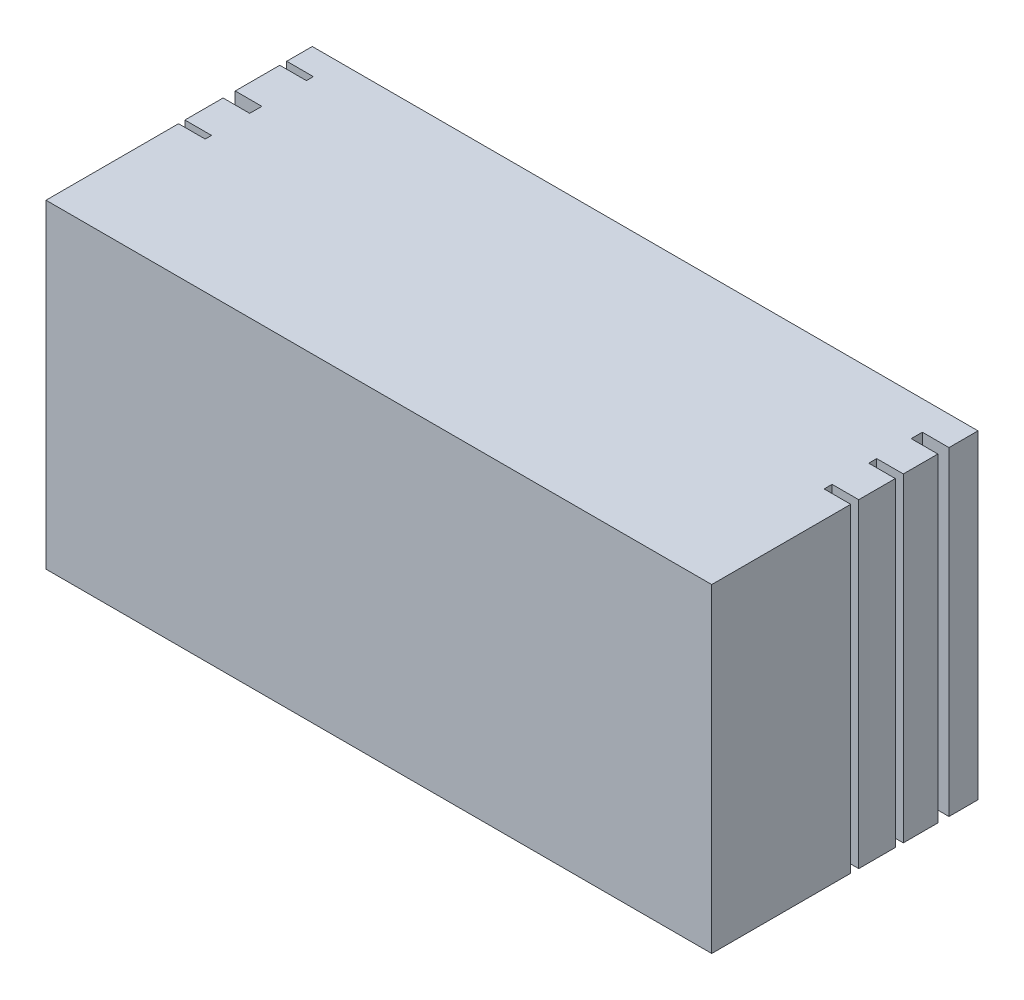
ISO-10303-21;
HEADER;
FILE_DESCRIPTION(('STEP AP214'),'2;1');
FILE_NAME('part.step','',(''),(''),'','','');
FILE_SCHEMA(('AUTOMOTIVE_DESIGN { 1 0 10303 214 1 1 1 1 }'));
ENDSEC;
DATA;
#1=APPLICATION_CONTEXT('core data for automotive mechanical design processes');
#2=APPLICATION_PROTOCOL_DEFINITION('international standard','automotive_design',2000,#1);
#3=PRODUCT_CONTEXT('',#1,'mechanical');
#4=PRODUCT('Part','Part','',(#3));
#5=PRODUCT_RELATED_PRODUCT_CATEGORY('part','',(#4));
#6=PRODUCT_DEFINITION_FORMATION('','',#4);
#7=PRODUCT_DEFINITION_CONTEXT('part definition',#1,'design');
#8=PRODUCT_DEFINITION('design','',#6,#7);
#9=PRODUCT_DEFINITION_SHAPE('','',#8);
#10=(LENGTH_UNIT() NAMED_UNIT(*) SI_UNIT(.MILLI.,.METRE.));
#11=(NAMED_UNIT(*) PLANE_ANGLE_UNIT() SI_UNIT($,.RADIAN.));
#12=(NAMED_UNIT(*) SI_UNIT($,.STERADIAN.) SOLID_ANGLE_UNIT());
#13=UNCERTAINTY_MEASURE_WITH_UNIT(LENGTH_MEASURE(1.E-05),#10,'distance_accuracy_value','');
#14=(GEOMETRIC_REPRESENTATION_CONTEXT(3) GLOBAL_UNCERTAINTY_ASSIGNED_CONTEXT((#13)) GLOBAL_UNIT_ASSIGNED_CONTEXT((#10,
#11,#12)) REPRESENTATION_CONTEXT('',''));
#15=CARTESIAN_POINT('',(0.,0.,0.));
#16=DIRECTION('',(0.,0.,1.));
#17=DIRECTION('',(1.,0.,0.));
#18=AXIS2_PLACEMENT_3D('',#15,#16,#17);
#19=CARTESIAN_POINT('',(-80.,60.,100.));
#20=DIRECTION('',(1.,0.,0.));
#21=DIRECTION('',(0.,1.,0.));
#22=AXIS2_PLACEMENT_3D('',#19,#20,#21);
#23=PLANE('',#22);
#24=DIRECTION('',(0.,0.,-1.));
#25=VECTOR('',#24,1.);
#26=CARTESIAN_POINT('',(-80.,-60.,100.));
#27=LINE('',#26,#25);
#28=CARTESIAN_POINT('',(-80.,-60.,9.60709957004355));
#29=VERTEX_POINT('',#28);
#30=CARTESIAN_POINT('',(-80.,-60.,0.));
#31=VERTEX_POINT('',#30);
#32=EDGE_CURVE('E267',#29,#31,#27,.T.);
#33=ORIENTED_EDGE('',*,*,#32,.F.);
#34=DIRECTION('',(0.,-1.,0.));
#35=VECTOR('',#34,1.);
#36=CARTESIAN_POINT('',(-80.,69.9495288911961,9.60709957004355));
#37=LINE('',#36,#35);
#38=CARTESIAN_POINT('',(-80.,60.,9.60709957004355));
#39=VERTEX_POINT('',#38);
#40=EDGE_CURVE('E433',#39,#29,#37,.T.);
#41=ORIENTED_EDGE('',*,*,#40,.F.);
#42=DIRECTION('',(0.,0.,-1.));
#43=VECTOR('',#42,1.);
#44=CARTESIAN_POINT('',(-80.,60.,100.));
#45=LINE('',#44,#43);
#46=CARTESIAN_POINT('',(-80.,60.,0.));
#47=VERTEX_POINT('',#46);
#48=EDGE_CURVE('E253',#39,#47,#45,.T.);
#49=ORIENTED_EDGE('',*,*,#48,.T.);
#50=DIRECTION('',(0.,-1.,0.));
#51=VECTOR('',#50,1.);
#52=CARTESIAN_POINT('',(-80.,60.,0.));
#53=LINE('',#52,#51);
#54=EDGE_CURVE('E405',#47,#31,#53,.T.);
#55=ORIENTED_EDGE('',*,*,#54,.T.);
#56=EDGE_LOOP('',(#33,#41,#49,#55));
#57=FACE_BOUND('',#56,.T.);
#58=ADVANCED_FACE('F35',(#57),#23,.F.);
#59=CARTESIAN_POINT('',(-80.,60.,28.9399266792238));
#60=VERTEX_POINT('',#59);
#61=CARTESIAN_POINT('',(-80.,60.,12.2137728881353));
#62=VERTEX_POINT('',#61);
#63=EDGE_CURVE('E249',#60,#62,#45,.T.);
#64=ORIENTED_EDGE('',*,*,#63,.T.);
#65=DIRECTION('',(0.,1.,0.));
#66=VECTOR('',#65,1.);
#67=CARTESIAN_POINT('',(-80.,69.9495288911961,12.2137728881353));
#68=LINE('',#67,#66);
#69=CARTESIAN_POINT('',(-80.,-60.,12.2137728881353));
#70=VERTEX_POINT('',#69);
#71=EDGE_CURVE('E315',#70,#62,#68,.T.);
#72=ORIENTED_EDGE('',*,*,#71,.F.);
#73=CARTESIAN_POINT('',(-80.,-60.,28.9399266792238));
#74=VERTEX_POINT('',#73);
#75=EDGE_CURVE('E318',#74,#70,#27,.T.);
#76=ORIENTED_EDGE('',*,*,#75,.F.);
#77=DIRECTION('',(0.,-1.,0.));
#78=VECTOR('',#77,1.);
#79=CARTESIAN_POINT('',(-80.,69.9495288911961,28.9399266792238));
#80=LINE('',#79,#78);
#81=EDGE_CURVE('E317',#60,#74,#80,.T.);
#82=ORIENTED_EDGE('',*,*,#81,.F.);
#83=EDGE_LOOP('',(#64,#72,#76,#82));
#84=FACE_BOUND('',#83,.T.);
#85=ADVANCED_FACE('F313',(#84),#23,.F.);
#86=CARTESIAN_POINT('',(-80.,60.,47.8383082353889));
#87=VERTEX_POINT('',#86);
#88=CARTESIAN_POINT('',(-80.,60.,33.5016049858844));
#89=VERTEX_POINT('',#88);
#90=EDGE_CURVE('E238',#87,#89,#45,.T.);
#91=ORIENTED_EDGE('',*,*,#90,.T.);
#92=DIRECTION('',(0.,1.,0.));
#93=VECTOR('',#92,1.);
#94=CARTESIAN_POINT('',(-80.,69.9495288911961,33.5016049858844));
#95=LINE('',#94,#93);
#96=CARTESIAN_POINT('',(-80.,-60.,33.5016049858844));
#97=VERTEX_POINT('',#96);
#98=EDGE_CURVE('E321',#97,#89,#95,.T.);
#99=ORIENTED_EDGE('',*,*,#98,.F.);
#100=CARTESIAN_POINT('',(-80.,-60.,47.8383082353889));
#101=VERTEX_POINT('',#100);
#102=EDGE_CURVE('E240',#101,#97,#27,.T.);
#103=ORIENTED_EDGE('',*,*,#102,.F.);
#104=DIRECTION('',(0.,-1.,0.));
#105=VECTOR('',#104,1.);
#106=CARTESIAN_POINT('',(-80.,69.9495288911961,47.8383082353889));
#107=LINE('',#106,#105);
#108=EDGE_CURVE('E223',#87,#101,#107,.T.);
#109=ORIENTED_EDGE('',*,*,#108,.F.);
#110=EDGE_LOOP('',(#91,#99,#103,#109));
#111=FACE_BOUND('',#110,.T.);
#112=ADVANCED_FACE('F236',(#111),#23,.F.);
#113=CARTESIAN_POINT('',(170.,60.,100.));
#114=DIRECTION('',(-1.,0.,0.));
#115=DIRECTION('',(0.,-1.,0.));
#116=AXIS2_PLACEMENT_3D('',#113,#114,#115);
#117=PLANE('',#116);
#118=DIRECTION('',(0.,0.,-1.));
#119=VECTOR('',#118,1.);
#120=CARTESIAN_POINT('',(170.,-60.,100.));
#121=LINE('',#120,#119);
#122=CARTESIAN_POINT('',(170.,-60.,100.));
#123=VERTEX_POINT('',#122);
#124=CARTESIAN_POINT('',(170.,-60.,47.796564822313));
#125=VERTEX_POINT('',#124);
#126=EDGE_CURVE('E264',#123,#125,#121,.T.);
#127=ORIENTED_EDGE('',*,*,#126,.T.);
#128=DIRECTION('',(0.,-1.,0.));
#129=VECTOR('',#128,1.);
#130=CARTESIAN_POINT('',(170.,73.27997279776,47.796564822313));
#131=LINE('',#130,#129);
#132=CARTESIAN_POINT('',(170.,60.,47.796564822313));
#133=VERTEX_POINT('',#132);
#134=EDGE_CURVE('E362',#133,#125,#131,.T.);
#135=ORIENTED_EDGE('',*,*,#134,.F.);
#136=DIRECTION('',(0.,0.,-1.));
#137=VECTOR('',#136,1.);
#138=CARTESIAN_POINT('',(170.,60.,100.));
#139=LINE('',#138,#137);
#140=CARTESIAN_POINT('',(170.,60.,100.));
#141=VERTEX_POINT('',#140);
#142=EDGE_CURVE('E259',#141,#133,#139,.T.);
#143=ORIENTED_EDGE('',*,*,#142,.F.);
#144=DIRECTION('',(0.,1.,0.));
#145=VECTOR('',#144,1.);
#146=CARTESIAN_POINT('',(170.,60.,100.));
#147=LINE('',#146,#145);
#148=EDGE_CURVE('E411',#123,#141,#147,.T.);
#149=ORIENTED_EDGE('',*,*,#148,.F.);
#150=EDGE_LOOP('',(#127,#135,#143,#149));
#151=FACE_BOUND('',#150,.T.);
#152=ADVANCED_FACE('F477',(#151),#117,.F.);
#153=CARTESIAN_POINT('',(170.,60.,44.796564822313));
#154=VERTEX_POINT('',#153);
#155=CARTESIAN_POINT('',(170.,60.,31.0468567542537));
#156=VERTEX_POINT('',#155);
#157=EDGE_CURVE('E263',#154,#156,#139,.T.);
#158=ORIENTED_EDGE('',*,*,#157,.F.);
#159=DIRECTION('',(0.,1.,0.));
#160=VECTOR('',#159,1.);
#161=CARTESIAN_POINT('',(170.,73.27997279776,44.796564822313));
#162=LINE('',#161,#160);
#163=CARTESIAN_POINT('',(170.,-60.,44.796564822313));
#164=VERTEX_POINT('',#163);
#165=EDGE_CURVE('E359',#164,#154,#162,.T.);
#166=ORIENTED_EDGE('',*,*,#165,.F.);
#167=CARTESIAN_POINT('',(170.,-60.,31.0468567542537));
#168=VERTEX_POINT('',#167);
#169=EDGE_CURVE('E268',#164,#168,#121,.T.);
#170=ORIENTED_EDGE('',*,*,#169,.T.);
#171=DIRECTION('',(0.,-1.,0.));
#172=VECTOR('',#171,1.);
#173=CARTESIAN_POINT('',(170.,73.27997279776,31.0468567542537));
#174=LINE('',#173,#172);
#175=EDGE_CURVE('E371',#156,#168,#174,.T.);
#176=ORIENTED_EDGE('',*,*,#175,.F.);
#177=EDGE_LOOP('',(#158,#166,#170,#176));
#178=FACE_BOUND('',#177,.T.);
#179=ADVANCED_FACE('F473',(#178),#117,.F.);
#180=CARTESIAN_POINT('',(170.,60.,28.0468567542537));
#181=VERTEX_POINT('',#180);
#182=CARTESIAN_POINT('',(170.,60.,15.0822912518846));
#183=VERTEX_POINT('',#182);
#184=EDGE_CURVE('E494',#181,#183,#139,.T.);
#185=ORIENTED_EDGE('',*,*,#184,.F.);
#186=DIRECTION('',(0.,1.,0.));
#187=VECTOR('',#186,1.);
#188=CARTESIAN_POINT('',(170.,73.27997279776,28.0468567542537));
#189=LINE('',#188,#187);
#190=CARTESIAN_POINT('',(170.,-60.,28.0468567542537));
#191=VERTEX_POINT('',#190);
#192=EDGE_CURVE('E369',#191,#181,#189,.T.);
#193=ORIENTED_EDGE('',*,*,#192,.F.);
#194=CARTESIAN_POINT('',(170.,-60.,15.0822912518846));
#195=VERTEX_POINT('',#194);
#196=EDGE_CURVE('E520',#191,#195,#121,.T.);
#197=ORIENTED_EDGE('',*,*,#196,.T.);
#198=DIRECTION('',(0.,-1.,0.));
#199=VECTOR('',#198,1.);
#200=CARTESIAN_POINT('',(170.,73.27997279776,15.0822912518846));
#201=LINE('',#200,#199);
#202=EDGE_CURVE('E354',#183,#195,#201,.T.);
#203=ORIENTED_EDGE('',*,*,#202,.F.);
#204=EDGE_LOOP('',(#185,#193,#197,#203));
#205=FACE_BOUND('',#204,.T.);
#206=ADVANCED_FACE('F466',(#205),#117,.F.);
#207=CARTESIAN_POINT('',(-80.,60.,100.));
#208=VERTEX_POINT('',#207);
#209=CARTESIAN_POINT('',(-80.,60.,50.227758776973));
#210=VERTEX_POINT('',#209);
#211=EDGE_CURVE('E248',#208,#210,#45,.T.);
#212=ORIENTED_EDGE('',*,*,#211,.T.);
#213=DIRECTION('',(0.,1.,0.));
#214=VECTOR('',#213,1.);
#215=CARTESIAN_POINT('',(-80.,69.9495288911961,50.227758776973));
#216=LINE('',#215,#214);
#217=CARTESIAN_POINT('',(-80.,-60.,50.227758776973));
#218=VERTEX_POINT('',#217);
#219=EDGE_CURVE('E241',#218,#210,#216,.T.);
#220=ORIENTED_EDGE('',*,*,#219,.F.);
#221=CARTESIAN_POINT('',(-80.,-60.,100.));
#222=VERTEX_POINT('',#221);
#223=EDGE_CURVE('E269',#222,#218,#27,.T.);
#224=ORIENTED_EDGE('',*,*,#223,.F.);
#225=DIRECTION('',(0.,-1.,0.));
#226=VECTOR('',#225,1.);
#227=CARTESIAN_POINT('',(-80.,60.,100.));
#228=LINE('',#227,#226);
#229=EDGE_CURVE('E406',#208,#222,#228,.T.);
#230=ORIENTED_EDGE('',*,*,#229,.F.);
#231=EDGE_LOOP('',(#212,#220,#224,#230));
#232=FACE_BOUND('',#231,.T.);
#233=ADVANCED_FACE('F37',(#232),#23,.F.);
#234=CARTESIAN_POINT('',(-80.,-60.,100.));
#235=DIRECTION('',(0.,1.,0.));
#236=DIRECTION('',(0.,0.,1.));
#237=AXIS2_PLACEMENT_3D('',#234,#235,#236);
#238=PLANE('',#237);
#239=DIRECTION('',(0.,0.,1.));
#240=VECTOR('',#239,1.);
#241=CARTESIAN_POINT('',(-70.,-60.,100.));
#242=LINE('',#241,#240);
#243=CARTESIAN_POINT('',(-70.,-60.,9.60709957004355));
#244=VERTEX_POINT('',#243);
#245=CARTESIAN_POINT('',(-70.,-60.,12.2137728881353));
#246=VERTEX_POINT('',#245);
#247=EDGE_CURVE('E346',#244,#246,#242,.T.);
#248=ORIENTED_EDGE('',*,*,#247,.F.);
#249=DIRECTION('',(-1.,0.,0.));
#250=VECTOR('',#249,1.);
#251=CARTESIAN_POINT('',(-80.,-60.,9.60709957004355));
#252=LINE('',#251,#250);
#253=EDGE_CURVE('E351',#244,#29,#252,.T.);
#254=ORIENTED_EDGE('',*,*,#253,.T.);
#255=ORIENTED_EDGE('',*,*,#32,.T.);
#256=DIRECTION('',(1.,0.,0.));
#257=VECTOR('',#256,1.);
#258=CARTESIAN_POINT('',(-80.,-60.,0.));
#259=LINE('',#258,#257);
#260=CARTESIAN_POINT('',(170.,-60.,0.));
#261=VERTEX_POINT('',#260);
#262=EDGE_CURVE('E417',#31,#261,#259,.T.);
#263=ORIENTED_EDGE('',*,*,#262,.T.);
#264=CARTESIAN_POINT('',(170.,-60.,10.8948642348698));
#265=VERTEX_POINT('',#264);
#266=EDGE_CURVE('E262',#265,#261,#121,.T.);
#267=ORIENTED_EDGE('',*,*,#266,.F.);
#268=DIRECTION('',(-1.,0.,0.));
#269=VECTOR('',#268,1.);
#270=CARTESIAN_POINT('',(-80.,-60.,10.8948642348698));
#271=LINE('',#270,#269);
#272=CARTESIAN_POINT('',(160.,-60.,10.8948642348698));
#273=VERTEX_POINT('',#272);
#274=EDGE_CURVE('E383',#265,#273,#271,.T.);
#275=ORIENTED_EDGE('',*,*,#274,.T.);
#276=DIRECTION('',(0.,0.,-1.));
#277=VECTOR('',#276,1.);
#278=CARTESIAN_POINT('',(160.,-60.,100.));
#279=LINE('',#278,#277);
#280=CARTESIAN_POINT('',(160.,-60.,15.0822912518846));
#281=VERTEX_POINT('',#280);
#282=EDGE_CURVE('E361',#281,#273,#279,.T.);
#283=ORIENTED_EDGE('',*,*,#282,.F.);
#284=DIRECTION('',(1.,0.,0.));
#285=VECTOR('',#284,1.);
#286=CARTESIAN_POINT('',(-80.,-60.,15.0822912518846));
#287=LINE('',#286,#285);
#288=EDGE_CURVE('E386',#281,#195,#287,.T.);
#289=ORIENTED_EDGE('',*,*,#288,.T.);
#290=ORIENTED_EDGE('',*,*,#196,.F.);
#291=DIRECTION('',(-1.,0.,0.));
#292=VECTOR('',#291,1.);
#293=CARTESIAN_POINT('',(-80.,-60.,28.0468567542537));
#294=LINE('',#293,#292);
#295=CARTESIAN_POINT('',(160.,-60.,28.0468567542537));
#296=VERTEX_POINT('',#295);
#297=EDGE_CURVE('E391',#191,#296,#294,.T.);
#298=ORIENTED_EDGE('',*,*,#297,.T.);
#299=DIRECTION('',(0.,0.,-1.));
#300=VECTOR('',#299,1.);
#301=CARTESIAN_POINT('',(160.,-60.,100.));
#302=LINE('',#301,#300);
#303=CARTESIAN_POINT('',(160.,-60.,31.0468567542537));
#304=VERTEX_POINT('',#303);
#305=EDGE_CURVE('E389',#304,#296,#302,.T.);
#306=ORIENTED_EDGE('',*,*,#305,.F.);
#307=DIRECTION('',(1.,0.,0.));
#308=VECTOR('',#307,1.);
#309=CARTESIAN_POINT('',(-80.,-60.,31.0468567542537));
#310=LINE('',#309,#308);
#311=EDGE_CURVE('E394',#304,#168,#310,.T.);
#312=ORIENTED_EDGE('',*,*,#311,.T.);
#313=ORIENTED_EDGE('',*,*,#169,.F.);
#314=DIRECTION('',(-1.,0.,0.));
#315=VECTOR('',#314,1.);
#316=CARTESIAN_POINT('',(-80.,-60.,44.796564822313));
#317=LINE('',#316,#315);
#318=CARTESIAN_POINT('',(160.,-60.,44.796564822313));
#319=VERTEX_POINT('',#318);
#320=EDGE_CURVE('E399',#164,#319,#317,.T.);
#321=ORIENTED_EDGE('',*,*,#320,.T.);
#322=DIRECTION('',(0.,0.,-1.));
#323=VECTOR('',#322,1.);
#324=CARTESIAN_POINT('',(160.,-60.,100.));
#325=LINE('',#324,#323);
#326=CARTESIAN_POINT('',(160.,-60.,47.796564822313));
#327=VERTEX_POINT('',#326);
#328=EDGE_CURVE('E397',#327,#319,#325,.T.);
#329=ORIENTED_EDGE('',*,*,#328,.F.);
#330=DIRECTION('',(1.,0.,0.));
#331=VECTOR('',#330,1.);
#332=CARTESIAN_POINT('',(-80.,-60.,47.796564822313));
#333=LINE('',#332,#331);
#334=EDGE_CURVE('E402',#327,#125,#333,.T.);
#335=ORIENTED_EDGE('',*,*,#334,.T.);
#336=ORIENTED_EDGE('',*,*,#126,.F.);
#337=DIRECTION('',(1.,0.,0.));
#338=VECTOR('',#337,1.);
#339=CARTESIAN_POINT('',(-80.,-60.,100.));
#340=LINE('',#339,#338);
#341=EDGE_CURVE('E409',#222,#123,#340,.T.);
#342=ORIENTED_EDGE('',*,*,#341,.F.);
#343=ORIENTED_EDGE('',*,*,#223,.T.);
#344=DIRECTION('',(1.,0.,0.));
#345=VECTOR('',#344,1.);
#346=CARTESIAN_POINT('',(-80.,-60.,50.227758776973));
#347=LINE('',#346,#345);
#348=CARTESIAN_POINT('',(-70.,-60.,50.227758776973));
#349=VERTEX_POINT('',#348);
#350=EDGE_CURVE('E334',#218,#349,#347,.T.);
#351=ORIENTED_EDGE('',*,*,#350,.T.);
#352=DIRECTION('',(0.,0.,1.));
#353=VECTOR('',#352,1.);
#354=CARTESIAN_POINT('',(-70.,-60.,100.));
#355=LINE('',#354,#353);
#356=CARTESIAN_POINT('',(-70.,-60.,47.8383082353889));
#357=VERTEX_POINT('',#356);
#358=EDGE_CURVE('E332',#357,#349,#355,.T.);
#359=ORIENTED_EDGE('',*,*,#358,.F.);
#360=DIRECTION('',(-1.,0.,0.));
#361=VECTOR('',#360,1.);
#362=CARTESIAN_POINT('',(-80.,-60.,47.8383082353889));
#363=LINE('',#362,#361);
#364=EDGE_CURVE('E337',#357,#101,#363,.T.);
#365=ORIENTED_EDGE('',*,*,#364,.T.);
#366=ORIENTED_EDGE('',*,*,#102,.T.);
#367=DIRECTION('',(1.,0.,0.));
#368=VECTOR('',#367,1.);
#369=CARTESIAN_POINT('',(-80.,-60.,33.5016049858844));
#370=LINE('',#369,#368);
#371=CARTESIAN_POINT('',(-70.,-60.,33.5016049858844));
#372=VERTEX_POINT('',#371);
#373=EDGE_CURVE('E341',#97,#372,#370,.T.);
#374=ORIENTED_EDGE('',*,*,#373,.T.);
#375=DIRECTION('',(0.,0.,1.));
#376=VECTOR('',#375,1.);
#377=CARTESIAN_POINT('',(-70.,-60.,100.));
#378=LINE('',#377,#376);
#379=CARTESIAN_POINT('',(-70.,-60.,28.9399266792238));
#380=VERTEX_POINT('',#379);
#381=EDGE_CURVE('E339',#380,#372,#378,.T.);
#382=ORIENTED_EDGE('',*,*,#381,.F.);
#383=DIRECTION('',(-1.,0.,0.));
#384=VECTOR('',#383,1.);
#385=CARTESIAN_POINT('',(-80.,-60.,28.9399266792238));
#386=LINE('',#385,#384);
#387=EDGE_CURVE('E344',#380,#74,#386,.T.);
#388=ORIENTED_EDGE('',*,*,#387,.T.);
#389=ORIENTED_EDGE('',*,*,#75,.T.);
#390=DIRECTION('',(1.,0.,0.));
#391=VECTOR('',#390,1.);
#392=CARTESIAN_POINT('',(-80.,-60.,12.2137728881353));
#393=LINE('',#392,#391);
#394=EDGE_CURVE('E348',#70,#246,#393,.T.);
#395=ORIENTED_EDGE('',*,*,#394,.T.);
#396=EDGE_LOOP('',(#248,#254,#255,#263,#267,#275,#283,#289,#290,#298,#306,#312,#313,#321,#329,
#335,#336,#342,#343,#351,#359,#365,#366,#374,#382,#388,#389,#395));
#397=FACE_BOUND('',#396,.T.);
#398=ADVANCED_FACE('F446',(#397),#238,.F.);
#399=CARTESIAN_POINT('',(170.,60.,10.8948642348698));
#400=VERTEX_POINT('',#399);
#401=CARTESIAN_POINT('',(170.,60.,0.));
#402=VERTEX_POINT('',#401);
#403=EDGE_CURVE('E252',#400,#402,#139,.T.);
#404=ORIENTED_EDGE('',*,*,#403,.F.);
#405=DIRECTION('',(0.,1.,0.));
#406=VECTOR('',#405,1.);
#407=CARTESIAN_POINT('',(170.,73.27997279776,10.8948642348698));
#408=LINE('',#407,#406);
#409=EDGE_CURVE('E378',#265,#400,#408,.T.);
#410=ORIENTED_EDGE('',*,*,#409,.F.);
#411=ORIENTED_EDGE('',*,*,#266,.T.);
#412=DIRECTION('',(0.,1.,0.));
#413=VECTOR('',#412,1.);
#414=CARTESIAN_POINT('',(170.,60.,0.));
#415=LINE('',#414,#413);
#416=EDGE_CURVE('E419',#261,#402,#415,.T.);
#417=ORIENTED_EDGE('',*,*,#416,.T.);
#418=EDGE_LOOP('',(#404,#410,#411,#417));
#419=FACE_BOUND('',#418,.T.);
#420=ADVANCED_FACE('F472',(#419),#117,.F.);
#421=CARTESIAN_POINT('',(-80.,60.,100.));
#422=DIRECTION('',(0.,-1.,0.));
#423=DIRECTION('',(0.,0.,-1.));
#424=AXIS2_PLACEMENT_3D('',#421,#422,#423);
#425=PLANE('',#424);
#426=ORIENTED_EDGE('',*,*,#48,.F.);
#427=DIRECTION('',(1.,0.,0.));
#428=VECTOR('',#427,1.);
#429=CARTESIAN_POINT('',(-80.,60.,9.60709957004355));
#430=LINE('',#429,#428);
#431=CARTESIAN_POINT('',(-70.,60.,9.60709957004355));
#432=VERTEX_POINT('',#431);
#433=EDGE_CURVE('E11',#39,#432,#430,.T.);
#434=ORIENTED_EDGE('',*,*,#433,.T.);
#435=DIRECTION('',(0.,0.,-1.));
#436=VECTOR('',#435,1.);
#437=CARTESIAN_POINT('',(-70.,60.,100.));
#438=LINE('',#437,#436);
#439=CARTESIAN_POINT('',(-70.,60.,12.2137728881353));
#440=VERTEX_POINT('',#439);
#441=EDGE_CURVE('E305',#440,#432,#438,.T.);
#442=ORIENTED_EDGE('',*,*,#441,.F.);
#443=DIRECTION('',(-1.,0.,0.));
#444=VECTOR('',#443,1.);
#445=CARTESIAN_POINT('',(-80.,60.,12.2137728881353));
#446=LINE('',#445,#444);
#447=EDGE_CURVE('E43',#440,#62,#446,.T.);
#448=ORIENTED_EDGE('',*,*,#447,.T.);
#449=ORIENTED_EDGE('',*,*,#63,.F.);
#450=DIRECTION('',(1.,0.,0.));
#451=VECTOR('',#450,1.);
#452=CARTESIAN_POINT('',(-80.,60.,28.9399266792238));
#453=LINE('',#452,#451);
#454=CARTESIAN_POINT('',(-70.,60.,28.9399266792238));
#455=VERTEX_POINT('',#454);
#456=EDGE_CURVE('E302',#60,#455,#453,.T.);
#457=ORIENTED_EDGE('',*,*,#456,.T.);
#458=DIRECTION('',(0.,0.,-1.));
#459=VECTOR('',#458,1.);
#460=CARTESIAN_POINT('',(-70.,60.,100.));
#461=LINE('',#460,#459);
#462=CARTESIAN_POINT('',(-70.,60.,33.5016049858844));
#463=VERTEX_POINT('',#462);
#464=EDGE_CURVE('E230',#463,#455,#461,.T.);
#465=ORIENTED_EDGE('',*,*,#464,.F.);
#466=DIRECTION('',(-1.,0.,0.));
#467=VECTOR('',#466,1.);
#468=CARTESIAN_POINT('',(-80.,60.,33.5016049858844));
#469=LINE('',#468,#467);
#470=EDGE_CURVE('E247',#463,#89,#469,.T.);
#471=ORIENTED_EDGE('',*,*,#470,.T.);
#472=ORIENTED_EDGE('',*,*,#90,.F.);
#473=DIRECTION('',(1.,0.,0.));
#474=VECTOR('',#473,1.);
#475=CARTESIAN_POINT('',(-80.,60.,47.8383082353889));
#476=LINE('',#475,#474);
#477=CARTESIAN_POINT('',(-70.,60.,47.8383082353889));
#478=VERTEX_POINT('',#477);
#479=EDGE_CURVE('E220',#87,#478,#476,.T.);
#480=ORIENTED_EDGE('',*,*,#479,.T.);
#481=DIRECTION('',(0.,0.,-1.));
#482=VECTOR('',#481,1.);
#483=CARTESIAN_POINT('',(-70.,60.,100.));
#484=LINE('',#483,#482);
#485=CARTESIAN_POINT('',(-70.,60.,50.227758776973));
#486=VERTEX_POINT('',#485);
#487=EDGE_CURVE('E296',#486,#478,#484,.T.);
#488=ORIENTED_EDGE('',*,*,#487,.F.);
#489=DIRECTION('',(-1.,0.,0.));
#490=VECTOR('',#489,1.);
#491=CARTESIAN_POINT('',(-80.,60.,50.227758776973));
#492=LINE('',#491,#490);
#493=EDGE_CURVE('E231',#486,#210,#492,.T.);
#494=ORIENTED_EDGE('',*,*,#493,.T.);
#495=ORIENTED_EDGE('',*,*,#211,.F.);
#496=DIRECTION('',(-1.,0.,0.));
#497=VECTOR('',#496,1.);
#498=CARTESIAN_POINT('',(-80.,60.,100.));
#499=LINE('',#498,#497);
#500=EDGE_CURVE('E413',#141,#208,#499,.T.);
#501=ORIENTED_EDGE('',*,*,#500,.F.);
#502=ORIENTED_EDGE('',*,*,#142,.T.);
#503=DIRECTION('',(-1.,0.,0.));
#504=VECTOR('',#503,1.);
#505=CARTESIAN_POINT('',(-80.,60.,47.796564822313));
#506=LINE('',#505,#504);
#507=CARTESIAN_POINT('',(160.,60.,47.796564822313));
#508=VERTEX_POINT('',#507);
#509=EDGE_CURVE('E293',#133,#508,#506,.T.);
#510=ORIENTED_EDGE('',*,*,#509,.T.);
#511=DIRECTION('',(0.,0.,1.));
#512=VECTOR('',#511,1.);
#513=CARTESIAN_POINT('',(160.,60.,100.));
#514=LINE('',#513,#512);
#515=CARTESIAN_POINT('',(160.,60.,44.796564822313));
#516=VERTEX_POINT('',#515);
#517=EDGE_CURVE('E288',#516,#508,#514,.T.);
#518=ORIENTED_EDGE('',*,*,#517,.F.);
#519=DIRECTION('',(1.,0.,0.));
#520=VECTOR('',#519,1.);
#521=CARTESIAN_POINT('',(-80.,60.,44.796564822313));
#522=LINE('',#521,#520);
#523=EDGE_CURVE('E290',#516,#154,#522,.T.);
#524=ORIENTED_EDGE('',*,*,#523,.T.);
#525=ORIENTED_EDGE('',*,*,#157,.T.);
#526=DIRECTION('',(-1.,0.,0.));
#527=VECTOR('',#526,1.);
#528=CARTESIAN_POINT('',(-80.,60.,31.0468567542537));
#529=LINE('',#528,#527);
#530=CARTESIAN_POINT('',(160.,60.,31.0468567542537));
#531=VERTEX_POINT('',#530);
#532=EDGE_CURVE('E285',#156,#531,#529,.T.);
#533=ORIENTED_EDGE('',*,*,#532,.T.);
#534=DIRECTION('',(0.,0.,1.));
#535=VECTOR('',#534,1.);
#536=CARTESIAN_POINT('',(160.,60.,100.));
#537=LINE('',#536,#535);
#538=CARTESIAN_POINT('',(160.,60.,28.0468567542537));
#539=VERTEX_POINT('',#538);
#540=EDGE_CURVE('E280',#539,#531,#537,.T.);
#541=ORIENTED_EDGE('',*,*,#540,.F.);
#542=DIRECTION('',(1.,0.,0.));
#543=VECTOR('',#542,1.);
#544=CARTESIAN_POINT('',(-80.,60.,28.0468567542537));
#545=LINE('',#544,#543);
#546=EDGE_CURVE('E282',#539,#181,#545,.T.);
#547=ORIENTED_EDGE('',*,*,#546,.T.);
#548=ORIENTED_EDGE('',*,*,#184,.T.);
#549=DIRECTION('',(-1.,0.,0.));
#550=VECTOR('',#549,1.);
#551=CARTESIAN_POINT('',(-80.,60.,15.0822912518846));
#552=LINE('',#551,#550);
#553=CARTESIAN_POINT('',(160.,60.,15.0822912518846));
#554=VERTEX_POINT('',#553);
#555=EDGE_CURVE('E277',#183,#554,#552,.T.);
#556=ORIENTED_EDGE('',*,*,#555,.T.);
#557=DIRECTION('',(0.,0.,1.));
#558=VECTOR('',#557,1.);
#559=CARTESIAN_POINT('',(160.,60.,100.));
#560=LINE('',#559,#558);
#561=CARTESIAN_POINT('',(160.,60.,10.8948642348698));
#562=VERTEX_POINT('',#561);
#563=EDGE_CURVE('E272',#562,#554,#560,.T.);
#564=ORIENTED_EDGE('',*,*,#563,.F.);
#565=DIRECTION('',(1.,0.,0.));
#566=VECTOR('',#565,1.);
#567=CARTESIAN_POINT('',(-80.,60.,10.8948642348698));
#568=LINE('',#567,#566);
#569=EDGE_CURVE('E274',#562,#400,#568,.T.);
#570=ORIENTED_EDGE('',*,*,#569,.T.);
#571=ORIENTED_EDGE('',*,*,#403,.T.);
#572=DIRECTION('',(-1.,0.,0.));
#573=VECTOR('',#572,1.);
#574=CARTESIAN_POINT('',(-80.,60.,0.));
#575=LINE('',#574,#573);
#576=EDGE_CURVE('E257',#402,#47,#575,.T.);
#577=ORIENTED_EDGE('',*,*,#576,.T.);
#578=EDGE_LOOP('',(#426,#434,#442,#448,#449,#457,#465,#471,#472,#480,#488,#494,#495,#501,#502,
#510,#518,#524,#525,#533,#541,#547,#548,#556,#564,#570,#571,#577));
#579=FACE_BOUND('',#578,.T.);
#580=ADVANCED_FACE('F245',(#579),#425,.F.);
#581=CARTESIAN_POINT('',(0.,0.,100.));
#582=DIRECTION('',(0.,0.,1.));
#583=DIRECTION('',(1.,0.,0.));
#584=AXIS2_PLACEMENT_3D('',#581,#582,#583);
#585=PLANE('',#584);
#586=ORIENTED_EDGE('',*,*,#229,.T.);
#587=ORIENTED_EDGE('',*,*,#341,.T.);
#588=ORIENTED_EDGE('',*,*,#148,.T.);
#589=ORIENTED_EDGE('',*,*,#500,.T.);
#590=EDGE_LOOP('',(#586,#587,#588,#589));
#591=FACE_BOUND('',#590,.T.);
#592=ADVANCED_FACE('F491',(#591),#585,.T.);
#593=CARTESIAN_POINT('',(0.,0.,0.));
#594=DIRECTION('',(0.,0.,1.));
#595=DIRECTION('',(1.,0.,0.));
#596=AXIS2_PLACEMENT_3D('',#593,#594,#595);
#597=PLANE('',#596);
#598=ORIENTED_EDGE('',*,*,#54,.F.);
#599=ORIENTED_EDGE('',*,*,#576,.F.);
#600=ORIENTED_EDGE('',*,*,#416,.F.);
#601=ORIENTED_EDGE('',*,*,#262,.F.);
#602=EDGE_LOOP('',(#598,#599,#600,#601));
#603=FACE_BOUND('',#602,.T.);
#604=ADVANCED_FACE('F429',(#603),#597,.F.);
#605=CARTESIAN_POINT('',(160.,73.27997279776,15.0822912518846));
#606=DIRECTION('',(0.,0.,1.));
#607=DIRECTION('',(1.,0.,0.));
#608=AXIS2_PLACEMENT_3D('',#605,#606,#607);
#609=PLANE('',#608);
#610=DIRECTION('',(0.,-1.,0.));
#611=VECTOR('',#610,1.);
#612=CARTESIAN_POINT('',(160.,73.27997279776,15.0822912518846));
#613=LINE('',#612,#611);
#614=EDGE_CURVE('E375',#554,#281,#613,.T.);
#615=ORIENTED_EDGE('',*,*,#614,.F.);
#616=ORIENTED_EDGE('',*,*,#555,.F.);
#617=ORIENTED_EDGE('',*,*,#202,.T.);
#618=ORIENTED_EDGE('',*,*,#288,.F.);
#619=EDGE_LOOP('',(#615,#616,#617,#618));
#620=FACE_BOUND('',#619,.T.);
#621=ADVANCED_FACE('F523',(#620),#609,.F.);
#622=CARTESIAN_POINT('',(160.,73.27997279776,10.8948642348698));
#623=DIRECTION('',(0.,0.,-1.));
#624=DIRECTION('',(-1.,0.,0.));
#625=AXIS2_PLACEMENT_3D('',#622,#623,#624);
#626=PLANE('',#625);
#627=ORIENTED_EDGE('',*,*,#409,.T.);
#628=ORIENTED_EDGE('',*,*,#569,.F.);
#629=DIRECTION('',(0.,1.,0.));
#630=VECTOR('',#629,1.);
#631=CARTESIAN_POINT('',(160.,73.27997279776,10.8948642348698));
#632=LINE('',#631,#630);
#633=EDGE_CURVE('E373',#273,#562,#632,.T.);
#634=ORIENTED_EDGE('',*,*,#633,.F.);
#635=ORIENTED_EDGE('',*,*,#274,.F.);
#636=EDGE_LOOP('',(#627,#628,#634,#635));
#637=FACE_BOUND('',#636,.T.);
#638=ADVANCED_FACE('F530',(#637),#626,.F.);
#639=CARTESIAN_POINT('',(160.,0.,0.));
#640=DIRECTION('',(1.,0.,0.));
#641=DIRECTION('',(0.,0.,-1.));
#642=AXIS2_PLACEMENT_3D('',#639,#640,#641);
#643=PLANE('',#642);
#644=ORIENTED_EDGE('',*,*,#282,.T.);
#645=ORIENTED_EDGE('',*,*,#633,.T.);
#646=ORIENTED_EDGE('',*,*,#563,.T.);
#647=ORIENTED_EDGE('',*,*,#614,.T.);
#648=EDGE_LOOP('',(#644,#645,#646,#647));
#649=FACE_BOUND('',#648,.T.);
#650=ADVANCED_FACE('F527',(#649),#643,.T.);
#651=CARTESIAN_POINT('',(160.,73.27997279776,31.0468567542537));
#652=DIRECTION('',(0.,0.,1.));
#653=DIRECTION('',(1.,0.,0.));
#654=AXIS2_PLACEMENT_3D('',#651,#652,#653);
#655=PLANE('',#654);
#656=DIRECTION('',(0.,-1.,0.));
#657=VECTOR('',#656,1.);
#658=CARTESIAN_POINT('',(160.,73.27997279776,31.0468567542537));
#659=LINE('',#658,#657);
#660=EDGE_CURVE('E366',#531,#304,#659,.T.);
#661=ORIENTED_EDGE('',*,*,#660,.F.);
#662=ORIENTED_EDGE('',*,*,#532,.F.);
#663=ORIENTED_EDGE('',*,*,#175,.T.);
#664=ORIENTED_EDGE('',*,*,#311,.F.);
#665=EDGE_LOOP('',(#661,#662,#663,#664));
#666=FACE_BOUND('',#665,.T.);
#667=ADVANCED_FACE('F508',(#666),#655,.F.);
#668=CARTESIAN_POINT('',(160.,73.27997279776,28.0468567542537));
#669=DIRECTION('',(0.,0.,-1.));
#670=DIRECTION('',(0.,1.,0.));
#671=AXIS2_PLACEMENT_3D('',#668,#669,#670);
#672=PLANE('',#671);
#673=ORIENTED_EDGE('',*,*,#192,.T.);
#674=ORIENTED_EDGE('',*,*,#546,.F.);
#675=DIRECTION('',(0.,1.,0.));
#676=VECTOR('',#675,1.);
#677=CARTESIAN_POINT('',(160.,73.27997279776,28.0468567542537));
#678=LINE('',#677,#676);
#679=EDGE_CURVE('E364',#296,#539,#678,.T.);
#680=ORIENTED_EDGE('',*,*,#679,.F.);
#681=ORIENTED_EDGE('',*,*,#297,.F.);
#682=EDGE_LOOP('',(#673,#674,#680,#681));
#683=FACE_BOUND('',#682,.T.);
#684=ADVANCED_FACE('F516',(#683),#672,.F.);
#685=CARTESIAN_POINT('',(160.,0.,0.));
#686=DIRECTION('',(1.,0.,0.));
#687=DIRECTION('',(0.,0.,-1.));
#688=AXIS2_PLACEMENT_3D('',#685,#686,#687);
#689=PLANE('',#688);
#690=ORIENTED_EDGE('',*,*,#305,.T.);
#691=ORIENTED_EDGE('',*,*,#679,.T.);
#692=ORIENTED_EDGE('',*,*,#540,.T.);
#693=ORIENTED_EDGE('',*,*,#660,.T.);
#694=EDGE_LOOP('',(#690,#691,#692,#693));
#695=FACE_BOUND('',#694,.T.);
#696=ADVANCED_FACE('F513',(#695),#689,.T.);
#697=CARTESIAN_POINT('',(160.,73.27997279776,47.796564822313));
#698=DIRECTION('',(0.,0.,1.));
#699=DIRECTION('',(1.,0.,0.));
#700=AXIS2_PLACEMENT_3D('',#697,#698,#699);
#701=PLANE('',#700);
#702=DIRECTION('',(0.,-1.,0.));
#703=VECTOR('',#702,1.);
#704=CARTESIAN_POINT('',(160.,73.27997279776,47.796564822313));
#705=LINE('',#704,#703);
#706=EDGE_CURVE('E355',#508,#327,#705,.T.);
#707=ORIENTED_EDGE('',*,*,#706,.F.);
#708=ORIENTED_EDGE('',*,*,#509,.F.);
#709=ORIENTED_EDGE('',*,*,#134,.T.);
#710=ORIENTED_EDGE('',*,*,#334,.F.);
#711=EDGE_LOOP('',(#707,#708,#709,#710));
#712=FACE_BOUND('',#711,.T.);
#713=ADVANCED_FACE('F592',(#712),#701,.F.);
#714=CARTESIAN_POINT('',(160.,73.27997279776,44.796564822313));
#715=DIRECTION('',(0.,0.,-1.));
#716=DIRECTION('',(0.,1.,0.));
#717=AXIS2_PLACEMENT_3D('',#714,#715,#716);
#718=PLANE('',#717);
#719=ORIENTED_EDGE('',*,*,#165,.T.);
#720=ORIENTED_EDGE('',*,*,#523,.F.);
#721=DIRECTION('',(0.,1.,0.));
#722=VECTOR('',#721,1.);
#723=CARTESIAN_POINT('',(160.,73.27997279776,44.796564822313));
#724=LINE('',#723,#722);
#725=EDGE_CURVE('E358',#319,#516,#724,.T.);
#726=ORIENTED_EDGE('',*,*,#725,.F.);
#727=ORIENTED_EDGE('',*,*,#320,.F.);
#728=EDGE_LOOP('',(#719,#720,#726,#727));
#729=FACE_BOUND('',#728,.T.);
#730=ADVANCED_FACE('F601',(#729),#718,.F.);
#731=CARTESIAN_POINT('',(160.,0.,0.));
#732=DIRECTION('',(1.,0.,0.));
#733=DIRECTION('',(0.,0.,-1.));
#734=AXIS2_PLACEMENT_3D('',#731,#732,#733);
#735=PLANE('',#734);
#736=ORIENTED_EDGE('',*,*,#328,.T.);
#737=ORIENTED_EDGE('',*,*,#725,.T.);
#738=ORIENTED_EDGE('',*,*,#517,.T.);
#739=ORIENTED_EDGE('',*,*,#706,.T.);
#740=EDGE_LOOP('',(#736,#737,#738,#739));
#741=FACE_BOUND('',#740,.T.);
#742=ADVANCED_FACE('F611',(#741),#735,.T.);
#743=CARTESIAN_POINT('',(-70.,69.9495288911961,47.8383082353889));
#744=DIRECTION('',(0.,0.,-1.));
#745=DIRECTION('',(-1.,0.,0.));
#746=AXIS2_PLACEMENT_3D('',#743,#744,#745);
#747=PLANE('',#746);
#748=DIRECTION('',(0.,-1.,0.));
#749=VECTOR('',#748,1.);
#750=CARTESIAN_POINT('',(-70.,69.9495288911961,47.8383082353889));
#751=LINE('',#750,#749);
#752=EDGE_CURVE('E226',#478,#357,#751,.T.);
#753=ORIENTED_EDGE('',*,*,#752,.F.);
#754=ORIENTED_EDGE('',*,*,#479,.F.);
#755=ORIENTED_EDGE('',*,*,#108,.T.);
#756=ORIENTED_EDGE('',*,*,#364,.F.);
#757=EDGE_LOOP('',(#753,#754,#755,#756));
#758=FACE_BOUND('',#757,.T.);
#759=ADVANCED_FACE('F222',(#758),#747,.F.);
#760=CARTESIAN_POINT('',(-70.,69.9495288911961,50.227758776973));
#761=DIRECTION('',(0.,0.,1.));
#762=DIRECTION('',(1.,0.,0.));
#763=AXIS2_PLACEMENT_3D('',#760,#761,#762);
#764=PLANE('',#763);
#765=ORIENTED_EDGE('',*,*,#219,.T.);
#766=ORIENTED_EDGE('',*,*,#493,.F.);
#767=DIRECTION('',(0.,1.,0.));
#768=VECTOR('',#767,1.);
#769=CARTESIAN_POINT('',(-70.,69.9495288911961,50.227758776973));
#770=LINE('',#769,#768);
#771=EDGE_CURVE('E322',#349,#486,#770,.T.);
#772=ORIENTED_EDGE('',*,*,#771,.F.);
#773=ORIENTED_EDGE('',*,*,#350,.F.);
#774=EDGE_LOOP('',(#765,#766,#772,#773));
#775=FACE_BOUND('',#774,.T.);
#776=ADVANCED_FACE('F458',(#775),#764,.F.);
#777=CARTESIAN_POINT('',(-70.,0.,0.));
#778=DIRECTION('',(-1.,0.,0.));
#779=DIRECTION('',(0.,-1.,0.));
#780=AXIS2_PLACEMENT_3D('',#777,#778,#779);
#781=PLANE('',#780);
#782=ORIENTED_EDGE('',*,*,#358,.T.);
#783=ORIENTED_EDGE('',*,*,#771,.T.);
#784=ORIENTED_EDGE('',*,*,#487,.T.);
#785=ORIENTED_EDGE('',*,*,#752,.T.);
#786=EDGE_LOOP('',(#782,#783,#784,#785));
#787=FACE_BOUND('',#786,.T.);
#788=ADVANCED_FACE('F451',(#787),#781,.T.);
#789=CARTESIAN_POINT('',(-70.,69.9495288911961,28.9399266792238));
#790=DIRECTION('',(0.,0.,-1.));
#791=DIRECTION('',(-1.,0.,0.));
#792=AXIS2_PLACEMENT_3D('',#789,#790,#791);
#793=PLANE('',#792);
#794=DIRECTION('',(0.,-1.,0.));
#795=VECTOR('',#794,1.);
#796=CARTESIAN_POINT('',(-70.,69.9495288911961,28.9399266792238));
#797=LINE('',#796,#795);
#798=EDGE_CURVE('E324',#455,#380,#797,.T.);
#799=ORIENTED_EDGE('',*,*,#798,.F.);
#800=ORIENTED_EDGE('',*,*,#456,.F.);
#801=ORIENTED_EDGE('',*,*,#81,.T.);
#802=ORIENTED_EDGE('',*,*,#387,.F.);
#803=EDGE_LOOP('',(#799,#800,#801,#802));
#804=FACE_BOUND('',#803,.T.);
#805=ADVANCED_FACE('F449',(#804),#793,.F.);
#806=CARTESIAN_POINT('',(-70.,69.9495288911961,33.5016049858844));
#807=DIRECTION('',(0.,0.,1.));
#808=DIRECTION('',(1.,0.,0.));
#809=AXIS2_PLACEMENT_3D('',#806,#807,#808);
#810=PLANE('',#809);
#811=ORIENTED_EDGE('',*,*,#98,.T.);
#812=ORIENTED_EDGE('',*,*,#470,.F.);
#813=DIRECTION('',(0.,1.,0.));
#814=VECTOR('',#813,1.);
#815=CARTESIAN_POINT('',(-70.,69.9495288911961,33.5016049858844));
#816=LINE('',#815,#814);
#817=EDGE_CURVE('E58',#372,#463,#816,.T.);
#818=ORIENTED_EDGE('',*,*,#817,.F.);
#819=ORIENTED_EDGE('',*,*,#373,.F.);
#820=EDGE_LOOP('',(#811,#812,#818,#819));
#821=FACE_BOUND('',#820,.T.);
#822=ADVANCED_FACE('F448',(#821),#810,.F.);
#823=CARTESIAN_POINT('',(-70.,0.,0.));
#824=DIRECTION('',(-1.,0.,0.));
#825=DIRECTION('',(0.,-1.,0.));
#826=AXIS2_PLACEMENT_3D('',#823,#824,#825);
#827=PLANE('',#826);
#828=ORIENTED_EDGE('',*,*,#381,.T.);
#829=ORIENTED_EDGE('',*,*,#817,.T.);
#830=ORIENTED_EDGE('',*,*,#464,.T.);
#831=ORIENTED_EDGE('',*,*,#798,.T.);
#832=EDGE_LOOP('',(#828,#829,#830,#831));
#833=FACE_BOUND('',#832,.T.);
#834=ADVANCED_FACE('F443',(#833),#827,.T.);
#835=CARTESIAN_POINT('',(-70.,69.9495288911961,9.60709957004355));
#836=DIRECTION('',(0.,0.,-1.));
#837=DIRECTION('',(-1.,0.,0.));
#838=AXIS2_PLACEMENT_3D('',#835,#836,#837);
#839=PLANE('',#838);
#840=DIRECTION('',(0.,-1.,0.));
#841=VECTOR('',#840,1.);
#842=CARTESIAN_POINT('',(-70.,69.9495288911961,9.60709957004355));
#843=LINE('',#842,#841);
#844=EDGE_CURVE('E436',#432,#244,#843,.T.);
#845=ORIENTED_EDGE('',*,*,#844,.F.);
#846=ORIENTED_EDGE('',*,*,#433,.F.);
#847=ORIENTED_EDGE('',*,*,#40,.T.);
#848=ORIENTED_EDGE('',*,*,#253,.F.);
#849=EDGE_LOOP('',(#845,#846,#847,#848));
#850=FACE_BOUND('',#849,.T.);
#851=ADVANCED_FACE('F694',(#850),#839,.F.);
#852=CARTESIAN_POINT('',(-70.,69.9495288911961,12.2137728881353));
#853=DIRECTION('',(0.,0.,1.));
#854=DIRECTION('',(1.,0.,0.));
#855=AXIS2_PLACEMENT_3D('',#852,#853,#854);
#856=PLANE('',#855);
#857=ORIENTED_EDGE('',*,*,#71,.T.);
#858=ORIENTED_EDGE('',*,*,#447,.F.);
#859=DIRECTION('',(0.,1.,0.));
#860=VECTOR('',#859,1.);
#861=CARTESIAN_POINT('',(-70.,69.9495288911961,12.2137728881353));
#862=LINE('',#861,#860);
#863=EDGE_CURVE('E50',#246,#440,#862,.T.);
#864=ORIENTED_EDGE('',*,*,#863,.F.);
#865=ORIENTED_EDGE('',*,*,#394,.F.);
#866=EDGE_LOOP('',(#857,#858,#864,#865));
#867=FACE_BOUND('',#866,.T.);
#868=ADVANCED_FACE('F703',(#867),#856,.F.);
#869=CARTESIAN_POINT('',(-70.,0.,0.));
#870=DIRECTION('',(-1.,0.,0.));
#871=DIRECTION('',(0.,-1.,0.));
#872=AXIS2_PLACEMENT_3D('',#869,#870,#871);
#873=PLANE('',#872);
#874=ORIENTED_EDGE('',*,*,#247,.T.);
#875=ORIENTED_EDGE('',*,*,#863,.T.);
#876=ORIENTED_EDGE('',*,*,#441,.T.);
#877=ORIENTED_EDGE('',*,*,#844,.T.);
#878=EDGE_LOOP('',(#874,#875,#876,#877));
#879=FACE_BOUND('',#878,.T.);
#880=ADVANCED_FACE('F712',(#879),#873,.T.);
#881=CLOSED_SHELL('',(#58,#85,#112,#152,#179,#206,#233,#398,#420,#580,#592,#604,#621,#638,#650,
#667,#684,#696,#713,#730,#742,#759,#776,#788,#805,#822,#834,#851,#868,#880));
#882=MANIFOLD_SOLID_BREP('B2',#881);
#883=ADVANCED_BREP_SHAPE_REPRESENTATION('',(#18,#882),#14);
#884=SHAPE_DEFINITION_REPRESENTATION(#9,#883);
ENDSEC;
END-ISO-10303-21;
